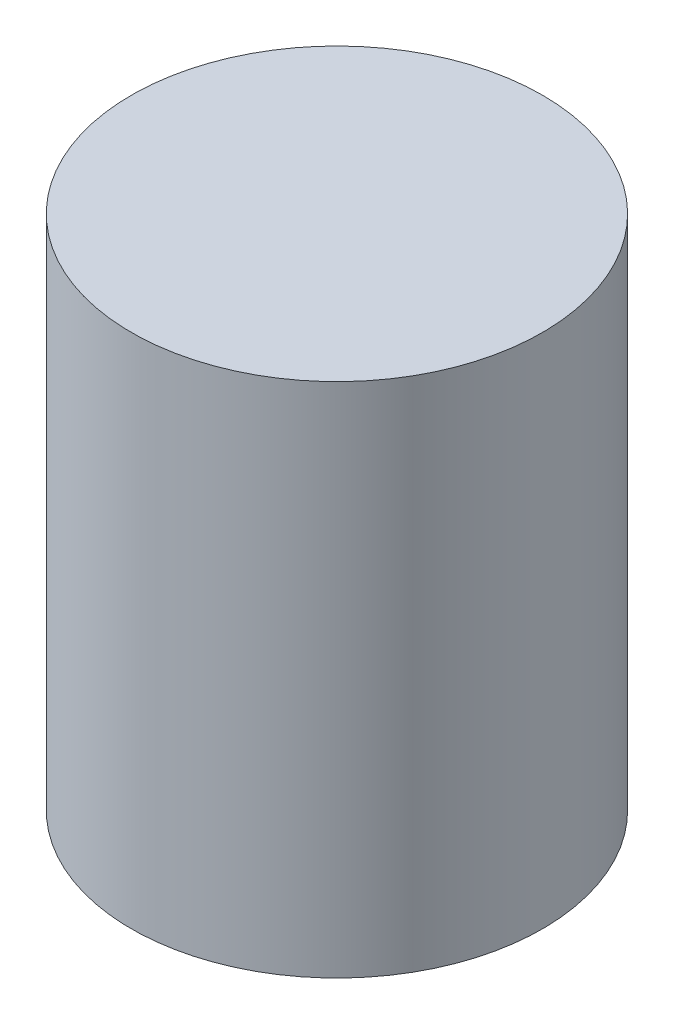
ISO-10303-21;
HEADER;
FILE_DESCRIPTION(('STEP AP214'),'2;1');
FILE_NAME('part.step','',(''),(''),'','','');
FILE_SCHEMA(('AUTOMOTIVE_DESIGN { 1 0 10303 214 1 1 1 1 }'));
ENDSEC;
DATA;
#1=APPLICATION_CONTEXT('core data for automotive mechanical design processes');
#2=APPLICATION_PROTOCOL_DEFINITION('international standard','automotive_design',2000,#1);
#3=PRODUCT_CONTEXT('',#1,'mechanical');
#4=PRODUCT('Part','Part','',(#3));
#5=PRODUCT_RELATED_PRODUCT_CATEGORY('part','',(#4));
#6=PRODUCT_DEFINITION_FORMATION('','',#4);
#7=PRODUCT_DEFINITION_CONTEXT('part definition',#1,'design');
#8=PRODUCT_DEFINITION('design','',#6,#7);
#9=PRODUCT_DEFINITION_SHAPE('','',#8);
#10=(LENGTH_UNIT() NAMED_UNIT(*) SI_UNIT(.MILLI.,.METRE.));
#11=(NAMED_UNIT(*) PLANE_ANGLE_UNIT() SI_UNIT($,.RADIAN.));
#12=(NAMED_UNIT(*) SI_UNIT($,.STERADIAN.) SOLID_ANGLE_UNIT());
#13=UNCERTAINTY_MEASURE_WITH_UNIT(LENGTH_MEASURE(1.E-05),#10,'distance_accuracy_value','');
#14=(GEOMETRIC_REPRESENTATION_CONTEXT(3) GLOBAL_UNCERTAINTY_ASSIGNED_CONTEXT((#13)) GLOBAL_UNIT_ASSIGNED_CONTEXT((#10,
#11,#12)) REPRESENTATION_CONTEXT('',''));
#15=CARTESIAN_POINT('',(0.,0.,0.));
#16=DIRECTION('',(0.,0.,1.));
#17=DIRECTION('',(1.,0.,0.));
#18=AXIS2_PLACEMENT_3D('',#15,#16,#17);
#19=CARTESIAN_POINT('',(0.,109.,0.));
#20=DIRECTION('',(0.,-1.,0.));
#21=DIRECTION('',(0.,0.,-1.));
#22=AXIS2_PLACEMENT_3D('',#19,#20,#21);
#23=CYLINDRICAL_SURFACE('',#22,43.3757675878027);
#24=CARTESIAN_POINT('',(0.,109.,0.));
#25=DIRECTION('',(0.,1.,0.));
#26=DIRECTION('',(0.,0.,1.));
#27=AXIS2_PLACEMENT_3D('',#24,#25,#26);
#28=CIRCLE('',#27,43.3757675878027);
#29=CARTESIAN_POINT('',(0.,109.,-43.3757675878027));
#30=VERTEX_POINT('',#29);
#31=EDGE_CURVE('E10',#30,#30,#28,.T.);
#32=CARTESIAN_POINT('',(0.,0.,0.));
#33=DIRECTION('',(0.,1.,0.));
#34=DIRECTION('',(0.,0.,1.));
#35=AXIS2_PLACEMENT_3D('',#32,#33,#34);
#36=CIRCLE('',#35,43.3757675878027);
#37=CARTESIAN_POINT('',(0.,0.,-43.3757675878027));
#38=VERTEX_POINT('',#37);
#39=EDGE_CURVE('E44',#38,#38,#36,.T.);
#40=CARTESIAN_POINT('',(0.,109.,-43.3757675878027));
#41=CARTESIAN_POINT('',(0.,107.864583333333,-43.3757675878027));
#42=CARTESIAN_POINT('',(0.,106.729166666667,-43.3757675878027));
#43=CARTESIAN_POINT('',(0.,104.458333333333,-43.3757675878027));
#44=CARTESIAN_POINT('',(0.,103.322916666667,-43.3757675878027));
#45=CARTESIAN_POINT('',(0.,101.052083333333,-43.3757675878027));
#46=CARTESIAN_POINT('',(0.,99.9166666666667,-43.3757675878027));
#47=CARTESIAN_POINT('',(0.,97.6458333333334,-43.3757675878027));
#48=CARTESIAN_POINT('',(0.,96.5104166666667,-43.3757675878027));
#49=CARTESIAN_POINT('',(0.,94.2395833333334,-43.3757675878027));
#50=CARTESIAN_POINT('',(0.,93.1041666666667,-43.3757675878027));
#51=CARTESIAN_POINT('',(0.,90.8333333333334,-43.3757675878027));
#52=CARTESIAN_POINT('',(0.,89.6979166666667,-43.3757675878027));
#53=CARTESIAN_POINT('',(0.,87.4270833333334,-43.3757675878027));
#54=CARTESIAN_POINT('',(0.,86.2916666666667,-43.3757675878027));
#55=CARTESIAN_POINT('',(0.,84.0208333333334,-43.3757675878027));
#56=CARTESIAN_POINT('',(0.,82.8854166666667,-43.3757675878027));
#57=CARTESIAN_POINT('',(0.,80.6145833333334,-43.3757675878027));
#58=CARTESIAN_POINT('',(0.,79.4791666666667,-43.3757675878027));
#59=CARTESIAN_POINT('',(0.,77.2083333333334,-43.3757675878027));
#60=CARTESIAN_POINT('',(0.,76.0729166666667,-43.3757675878027));
#61=CARTESIAN_POINT('',(0.,73.8020833333334,-43.3757675878027));
#62=CARTESIAN_POINT('',(0.,72.6666666666667,-43.3757675878027));
#63=CARTESIAN_POINT('',(0.,70.3958333333334,-43.3757675878027));
#64=CARTESIAN_POINT('',(0.,69.2604166666667,-43.3757675878027));
#65=CARTESIAN_POINT('',(0.,66.9895833333334,-43.3757675878027));
#66=CARTESIAN_POINT('',(0.,65.8541666666667,-43.3757675878027));
#67=CARTESIAN_POINT('',(0.,63.5833333333334,-43.3757675878027));
#68=CARTESIAN_POINT('',(0.,62.4479166666667,-43.3757675878027));
#69=CARTESIAN_POINT('',(0.,60.1770833333334,-43.3757675878027));
#70=CARTESIAN_POINT('',(0.,59.0416666666667,-43.3757675878027));
#71=CARTESIAN_POINT('',(0.,56.7708333333334,-43.3757675878027));
#72=CARTESIAN_POINT('',(0.,55.6354166666667,-43.3757675878027));
#73=CARTESIAN_POINT('',(0.,53.3645833333334,-43.3757675878027));
#74=CARTESIAN_POINT('',(0.,52.2291666666667,-43.3757675878027));
#75=CARTESIAN_POINT('',(0.,49.9583333333334,-43.3757675878027));
#76=CARTESIAN_POINT('',(0.,48.8229166666667,-43.3757675878027));
#77=CARTESIAN_POINT('',(0.,46.5520833333334,-43.3757675878027));
#78=CARTESIAN_POINT('',(0.,45.4166666666667,-43.3757675878027));
#79=CARTESIAN_POINT('',(0.,43.1458333333334,-43.3757675878027));
#80=CARTESIAN_POINT('',(0.,42.0104166666667,-43.3757675878027));
#81=CARTESIAN_POINT('',(0.,39.7395833333334,-43.3757675878027));
#82=CARTESIAN_POINT('',(0.,38.6041666666667,-43.3757675878027));
#83=CARTESIAN_POINT('',(0.,36.3333333333334,-43.3757675878027));
#84=CARTESIAN_POINT('',(0.,35.1979166666667,-43.3757675878027));
#85=CARTESIAN_POINT('',(0.,32.9270833333333,-43.3757675878027));
#86=CARTESIAN_POINT('',(0.,31.7916666666667,-43.3757675878027));
#87=CARTESIAN_POINT('',(0.,29.5208333333333,-43.3757675878027));
#88=CARTESIAN_POINT('',(0.,28.3854166666667,-43.3757675878027));
#89=CARTESIAN_POINT('',(0.,26.1145833333333,-43.3757675878027));
#90=CARTESIAN_POINT('',(0.,24.9791666666667,-43.3757675878027));
#91=CARTESIAN_POINT('',(0.,22.7083333333333,-43.3757675878027));
#92=CARTESIAN_POINT('',(0.,21.5729166666667,-43.3757675878027));
#93=CARTESIAN_POINT('',(0.,19.3020833333333,-43.3757675878027));
#94=CARTESIAN_POINT('',(0.,18.1666666666667,-43.3757675878027));
#95=CARTESIAN_POINT('',(0.,15.8958333333333,-43.3757675878027));
#96=CARTESIAN_POINT('',(0.,14.7604166666667,-43.3757675878027));
#97=CARTESIAN_POINT('',(0.,12.4895833333333,-43.3757675878027));
#98=CARTESIAN_POINT('',(0.,11.3541666666667,-43.3757675878027));
#99=CARTESIAN_POINT('',(0.,9.08333333333333,-43.3757675878027));
#100=CARTESIAN_POINT('',(0.,7.94791666666667,-43.3757675878027));
#101=CARTESIAN_POINT('',(0.,5.67708333333333,-43.3757675878027));
#102=CARTESIAN_POINT('',(0.,4.54166666666667,-43.3757675878027));
#103=CARTESIAN_POINT('',(0.,2.27083333333333,-43.3757675878027));
#104=CARTESIAN_POINT('',(0.,1.13541666666667,-43.3757675878027));
#105=CARTESIAN_POINT('',(0.,0.,-43.3757675878027));
#106=B_SPLINE_CURVE_WITH_KNOTS('',3,(#40,#41,#42,#43,#44,#45,#46,#47,#48,#49,#50,#51,#52,#53,
#54,#55,#56,#57,#58,#59,#60,#61,#62,#63,#64,#65,#66,#67,#68,#69,#70,#71,#72,#73,#74,#75,#76,#77,
#78,#79,#80,#81,#82,#83,#84,#85,#86,#87,#88,#89,#90,#91,#92,#93,#94,#95,#96,#97,#98,#99,#100,
#101,#102,#103,#104,#105),.UNSPECIFIED.,.F.,.F.,(4,2,2,2,2,2,2,2,2,2,2,2,2,2,2,2,2,2,2,2,2,2,2,
2,2,2,2,2,2,2,2,2,4),(0.,3.40625,6.8125,10.21875,13.625,17.03125,20.4375,23.84375,27.25,
30.65625,34.0625,37.46875,40.875,44.28125,47.6875,51.09375,54.5,57.90625,61.3125,64.71875,
68.125,71.53125,74.9375,78.34375,81.75,85.15625,88.5625,91.96875,95.375,98.78125,102.1875,
105.59375,109.),.UNSPECIFIED.);
#107=EDGE_CURVE('BSEAM41',#30,#38,#106,.T.);
#108=ORIENTED_EDGE('',*,*,#31,.F.);
#109=ORIENTED_EDGE('',*,*,#39,.T.);
#110=ORIENTED_EDGE('',*,*,#107,.T.);
#111=ORIENTED_EDGE('',*,*,#107,.F.);
#112=EDGE_LOOP('',(#108,#110,#109,#111));
#113=FACE_BOUND('',#112,.T.);
#114=ADVANCED_FACE('F41',(#113),#23,.T.);
#115=CARTESIAN_POINT('',(0.,109.,0.));
#116=DIRECTION('',(0.,1.,0.));
#117=DIRECTION('',(0.,0.,1.));
#118=AXIS2_PLACEMENT_3D('',#115,#116,#117);
#119=PLANE('',#118);
#120=ORIENTED_EDGE('',*,*,#31,.T.);
#121=EDGE_LOOP('',(#120));
#122=FACE_BOUND('',#121,.T.);
#123=ADVANCED_FACE('F58',(#122),#119,.T.);
#124=CARTESIAN_POINT('',(0.,0.,0.));
#125=DIRECTION('',(0.,1.,0.));
#126=DIRECTION('',(0.,0.,1.));
#127=AXIS2_PLACEMENT_3D('',#124,#125,#126);
#128=PLANE('',#127);
#129=ORIENTED_EDGE('',*,*,#39,.F.);
#130=EDGE_LOOP('',(#129));
#131=FACE_BOUND('',#130,.T.);
#132=ADVANCED_FACE('F56',(#131),#128,.F.);
#133=CLOSED_SHELL('',(#114,#123,#132));
#134=MANIFOLD_SOLID_BREP('B2',#133);
#135=ADVANCED_BREP_SHAPE_REPRESENTATION('',(#18,#134),#14);
#136=SHAPE_DEFINITION_REPRESENTATION(#9,#135);
ENDSEC;
END-ISO-10303-21;
